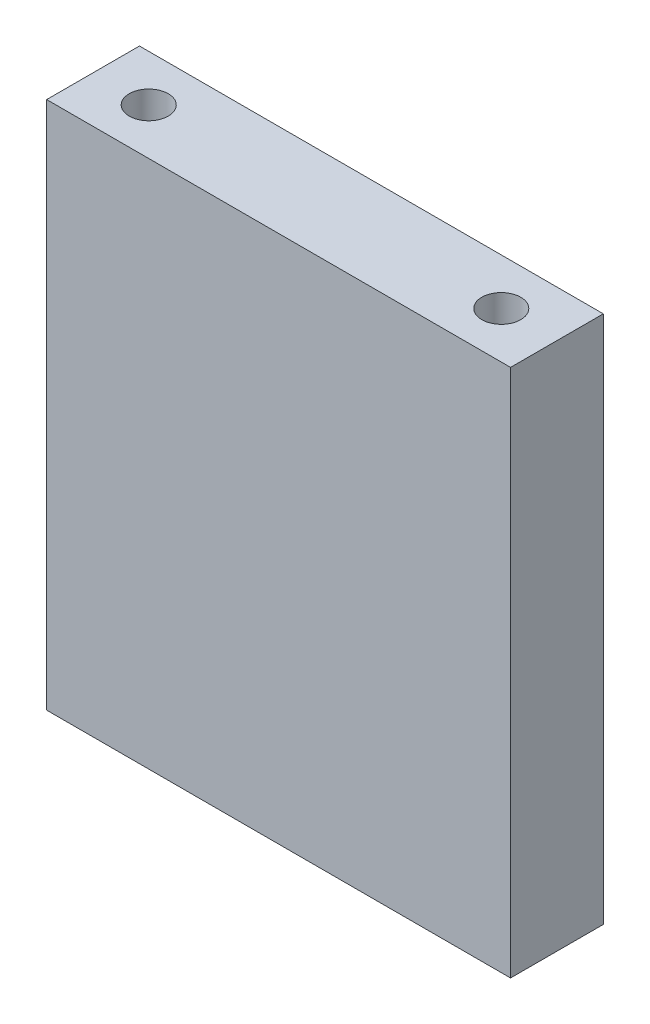
ISO-10303-21;
HEADER;
FILE_DESCRIPTION(('STEP AP214'),'2;1');
FILE_NAME('part.step','',(''),(''),'','','');
FILE_SCHEMA(('AUTOMOTIVE_DESIGN { 1 0 10303 214 1 1 1 1 }'));
ENDSEC;
DATA;
#1=APPLICATION_CONTEXT('core data for automotive mechanical design processes');
#2=APPLICATION_PROTOCOL_DEFINITION('international standard','automotive_design',2000,#1);
#3=PRODUCT_CONTEXT('',#1,'mechanical');
#4=PRODUCT('Part','Part','',(#3));
#5=PRODUCT_RELATED_PRODUCT_CATEGORY('part','',(#4));
#6=PRODUCT_DEFINITION_FORMATION('','',#4);
#7=PRODUCT_DEFINITION_CONTEXT('part definition',#1,'design');
#8=PRODUCT_DEFINITION('design','',#6,#7);
#9=PRODUCT_DEFINITION_SHAPE('','',#8);
#10=(LENGTH_UNIT() NAMED_UNIT(*) SI_UNIT(.MILLI.,.METRE.));
#11=(NAMED_UNIT(*) PLANE_ANGLE_UNIT() SI_UNIT($,.RADIAN.));
#12=(NAMED_UNIT(*) SI_UNIT($,.STERADIAN.) SOLID_ANGLE_UNIT());
#13=UNCERTAINTY_MEASURE_WITH_UNIT(LENGTH_MEASURE(1.E-05),#10,'distance_accuracy_value','');
#14=(GEOMETRIC_REPRESENTATION_CONTEXT(3) GLOBAL_UNCERTAINTY_ASSIGNED_CONTEXT((#13)) GLOBAL_UNIT_ASSIGNED_CONTEXT((#10,
#11,#12)) REPRESENTATION_CONTEXT('',''));
#15=CARTESIAN_POINT('',(0.,0.,0.));
#16=DIRECTION('',(0.,0.,1.));
#17=DIRECTION('',(1.,0.,0.));
#18=AXIS2_PLACEMENT_3D('',#15,#16,#17);
#19=CARTESIAN_POINT('',(0.,0.,0.));
#20=DIRECTION('',(0.,0.,-1.));
#21=DIRECTION('',(-1.,0.,0.));
#22=AXIS2_PLACEMENT_3D('',#19,#20,#21);
#23=PLANE('',#22);
#24=DIRECTION('',(0.,-1.,0.));
#25=VECTOR('',#24,1.);
#26=CARTESIAN_POINT('',(0.,0.,0.));
#27=LINE('',#26,#25);
#28=CARTESIAN_POINT('',(0.,57.,0.));
#29=VERTEX_POINT('',#28);
#30=CARTESIAN_POINT('',(0.,0.,0.));
#31=VERTEX_POINT('',#30);
#32=EDGE_CURVE('E137',#29,#31,#27,.T.);
#33=ORIENTED_EDGE('',*,*,#32,.F.);
#34=DIRECTION('',(-1.,0.,0.));
#35=VECTOR('',#34,1.);
#36=CARTESIAN_POINT('',(0.,57.,0.));
#37=LINE('',#36,#35);
#38=CARTESIAN_POINT('',(50.,57.,0.));
#39=VERTEX_POINT('',#38);
#40=EDGE_CURVE('E49',#39,#29,#37,.T.);
#41=ORIENTED_EDGE('',*,*,#40,.F.);
#42=DIRECTION('',(0.,1.,0.));
#43=VECTOR('',#42,1.);
#44=CARTESIAN_POINT('',(50.,0.,0.));
#45=LINE('',#44,#43);
#46=CARTESIAN_POINT('',(50.,0.,0.));
#47=VERTEX_POINT('',#46);
#48=EDGE_CURVE('E57',#47,#39,#45,.T.);
#49=ORIENTED_EDGE('',*,*,#48,.F.);
#50=DIRECTION('',(1.,0.,0.));
#51=VECTOR('',#50,1.);
#52=CARTESIAN_POINT('',(0.,0.,0.));
#53=LINE('',#52,#51);
#54=EDGE_CURVE('E140',#31,#47,#53,.T.);
#55=ORIENTED_EDGE('',*,*,#54,.F.);
#56=EDGE_LOOP('',(#33,#41,#49,#55));
#57=FACE_BOUND('',#56,.T.);
#58=CARTESIAN_POINT('',(25.,25.,0.));
#59=DIRECTION('',(0.,0.,1.));
#60=DIRECTION('',(1.,0.,0.));
#61=AXIS2_PLACEMENT_3D('',#58,#59,#60);
#62=CIRCLE('',#61,13.);
#63=CARTESIAN_POINT('',(38.,25.,0.));
#64=VERTEX_POINT('',#63);
#65=EDGE_CURVE('E134',#64,#64,#62,.T.);
#66=ORIENTED_EDGE('',*,*,#65,.T.);
#67=EDGE_LOOP('',(#66));
#68=FACE_BOUND('',#67,.T.);
#69=ADVANCED_FACE('F34',(#57,#68),#23,.T.);
#70=CARTESIAN_POINT('',(0.,0.,8.));
#71=DIRECTION('',(1.,0.,0.));
#72=DIRECTION('',(0.,1.,0.));
#73=AXIS2_PLACEMENT_3D('',#70,#71,#72);
#74=PLANE('',#73);
#75=ORIENTED_EDGE('',*,*,#32,.T.);
#76=DIRECTION('',(0.,0.,-1.));
#77=VECTOR('',#76,1.);
#78=CARTESIAN_POINT('',(0.,0.,8.));
#79=LINE('',#78,#77);
#80=CARTESIAN_POINT('',(0.,0.,10.));
#81=VERTEX_POINT('',#80);
#82=EDGE_CURVE('E11',#81,#31,#79,.T.);
#83=ORIENTED_EDGE('',*,*,#82,.F.);
#84=DIRECTION('',(0.,-1.,0.));
#85=VECTOR('',#84,1.);
#86=CARTESIAN_POINT('',(0.,57.,10.));
#87=LINE('',#86,#85);
#88=CARTESIAN_POINT('',(0.,57.,10.));
#89=VERTEX_POINT('',#88);
#90=EDGE_CURVE('E125',#89,#81,#87,.T.);
#91=ORIENTED_EDGE('',*,*,#90,.F.);
#92=DIRECTION('',(0.,0.,-1.));
#93=VECTOR('',#92,1.);
#94=CARTESIAN_POINT('',(0.,57.,8.));
#95=LINE('',#94,#93);
#96=EDGE_CURVE('E144',#89,#29,#95,.T.);
#97=ORIENTED_EDGE('',*,*,#96,.T.);
#98=EDGE_LOOP('',(#75,#83,#91,#97));
#99=FACE_BOUND('',#98,.T.);
#100=ADVANCED_FACE('F36',(#99),#74,.F.);
#101=CARTESIAN_POINT('',(0.,0.,8.));
#102=DIRECTION('',(0.,1.,0.));
#103=DIRECTION('',(-1.,0.,0.));
#104=AXIS2_PLACEMENT_3D('',#101,#102,#103);
#105=PLANE('',#104);
#106=CARTESIAN_POINT('',(6.,0.,5.));
#107=DIRECTION('',(0.,-1.,0.));
#108=DIRECTION('',(0.,0.,-1.));
#109=AXIS2_PLACEMENT_3D('',#106,#107,#108);
#110=CIRCLE('',#109,2.1);
#111=CARTESIAN_POINT('',(6.,0.,2.9));
#112=VERTEX_POINT('',#111);
#113=EDGE_CURVE('E107',#112,#112,#110,.T.);
#114=ORIENTED_EDGE('',*,*,#113,.F.);
#115=EDGE_LOOP('',(#114));
#116=FACE_BOUND('',#115,.T.);
#117=CARTESIAN_POINT('',(44.,0.,5.));
#118=DIRECTION('',(0.,-1.,0.));
#119=DIRECTION('',(0.,0.,-1.));
#120=AXIS2_PLACEMENT_3D('',#117,#118,#119);
#121=CIRCLE('',#120,2.1);
#122=CARTESIAN_POINT('',(44.,0.,2.9));
#123=VERTEX_POINT('',#122);
#124=EDGE_CURVE('E113',#123,#123,#121,.T.);
#125=ORIENTED_EDGE('',*,*,#124,.F.);
#126=EDGE_LOOP('',(#125));
#127=FACE_BOUND('',#126,.T.);
#128=ORIENTED_EDGE('',*,*,#54,.T.);
#129=DIRECTION('',(0.,0.,-1.));
#130=VECTOR('',#129,1.);
#131=CARTESIAN_POINT('',(50.,0.,8.));
#132=LINE('',#131,#130);
#133=CARTESIAN_POINT('',(50.,0.,10.));
#134=VERTEX_POINT('',#133);
#135=EDGE_CURVE('E42',#134,#47,#132,.T.);
#136=ORIENTED_EDGE('',*,*,#135,.F.);
#137=DIRECTION('',(1.,0.,0.));
#138=VECTOR('',#137,1.);
#139=CARTESIAN_POINT('',(50.,0.,10.));
#140=LINE('',#139,#138);
#141=EDGE_CURVE('E128',#81,#134,#140,.T.);
#142=ORIENTED_EDGE('',*,*,#141,.F.);
#143=ORIENTED_EDGE('',*,*,#82,.T.);
#144=EDGE_LOOP('',(#128,#136,#142,#143));
#145=FACE_BOUND('',#144,.T.);
#146=ADVANCED_FACE('F160',(#116,#127,#145),#105,.F.);
#147=CARTESIAN_POINT('',(50.,0.,8.));
#148=DIRECTION('',(-1.,0.,0.));
#149=DIRECTION('',(0.,-1.,0.));
#150=AXIS2_PLACEMENT_3D('',#147,#148,#149);
#151=PLANE('',#150);
#152=ORIENTED_EDGE('',*,*,#48,.T.);
#153=DIRECTION('',(0.,0.,-1.));
#154=VECTOR('',#153,1.);
#155=CARTESIAN_POINT('',(50.,57.,8.));
#156=LINE('',#155,#154);
#157=CARTESIAN_POINT('',(50.,57.,10.));
#158=VERTEX_POINT('',#157);
#159=EDGE_CURVE('E146',#158,#39,#156,.T.);
#160=ORIENTED_EDGE('',*,*,#159,.F.);
#161=DIRECTION('',(0.,1.,0.));
#162=VECTOR('',#161,1.);
#163=CARTESIAN_POINT('',(50.,57.,10.));
#164=LINE('',#163,#162);
#165=EDGE_CURVE('E119',#134,#158,#164,.T.);
#166=ORIENTED_EDGE('',*,*,#165,.F.);
#167=ORIENTED_EDGE('',*,*,#135,.T.);
#168=EDGE_LOOP('',(#152,#160,#166,#167));
#169=FACE_BOUND('',#168,.T.);
#170=ADVANCED_FACE('F148',(#169),#151,.F.);
#171=CARTESIAN_POINT('',(0.,57.,8.));
#172=DIRECTION('',(0.,-1.,0.));
#173=DIRECTION('',(0.,0.,-1.));
#174=AXIS2_PLACEMENT_3D('',#171,#172,#173);
#175=PLANE('',#174);
#176=CARTESIAN_POINT('',(6.,57.,5.));
#177=DIRECTION('',(0.,1.,0.));
#178=DIRECTION('',(0.,0.,1.));
#179=AXIS2_PLACEMENT_3D('',#176,#177,#178);
#180=CIRCLE('',#179,2.09999999999999);
#181=CARTESIAN_POINT('',(6.,57.,7.09999999999999));
#182=VERTEX_POINT('',#181);
#183=EDGE_CURVE('E97',#182,#182,#180,.T.);
#184=ORIENTED_EDGE('',*,*,#183,.F.);
#185=EDGE_LOOP('',(#184));
#186=FACE_BOUND('',#185,.T.);
#187=CARTESIAN_POINT('',(44.,57.,5.));
#188=DIRECTION('',(0.,1.,0.));
#189=DIRECTION('',(0.,0.,1.));
#190=AXIS2_PLACEMENT_3D('',#187,#188,#189);
#191=CIRCLE('',#190,2.09999999999999);
#192=CARTESIAN_POINT('',(44.,57.,7.09999999999999));
#193=VERTEX_POINT('',#192);
#194=EDGE_CURVE('E96',#193,#193,#191,.T.);
#195=ORIENTED_EDGE('',*,*,#194,.F.);
#196=EDGE_LOOP('',(#195));
#197=FACE_BOUND('',#196,.T.);
#198=ORIENTED_EDGE('',*,*,#40,.T.);
#199=ORIENTED_EDGE('',*,*,#96,.F.);
#200=DIRECTION('',(-1.,0.,0.));
#201=VECTOR('',#200,1.);
#202=CARTESIAN_POINT('',(50.,57.,10.));
#203=LINE('',#202,#201);
#204=EDGE_CURVE('E122',#158,#89,#203,.T.);
#205=ORIENTED_EDGE('',*,*,#204,.F.);
#206=ORIENTED_EDGE('',*,*,#159,.T.);
#207=EDGE_LOOP('',(#198,#199,#205,#206));
#208=FACE_BOUND('',#207,.T.);
#209=ADVANCED_FACE('F157',(#186,#197,#208),#175,.F.);
#210=CARTESIAN_POINT('',(25.,25.,8.));
#211=DIRECTION('',(0.,0.,-1.));
#212=DIRECTION('',(-1.,0.,0.));
#213=AXIS2_PLACEMENT_3D('',#210,#211,#212);
#214=CYLINDRICAL_SURFACE('',#213,13.);
#215=CARTESIAN_POINT('',(25.,25.,8.));
#216=DIRECTION('',(0.,0.,1.));
#217=DIRECTION('',(1.,0.,0.));
#218=AXIS2_PLACEMENT_3D('',#215,#216,#217);
#219=CIRCLE('',#218,13.);
#220=CARTESIAN_POINT('',(38.,25.,8.));
#221=VERTEX_POINT('',#220);
#222=EDGE_CURVE('E131',#221,#221,#219,.T.);
#223=ORIENTED_EDGE('',*,*,#222,.T.);
#224=EDGE_LOOP('',(#223));
#225=FACE_BOUND('',#224,.T.);
#226=ORIENTED_EDGE('',*,*,#65,.F.);
#227=EDGE_LOOP('',(#226));
#228=FACE_BOUND('',#227,.T.);
#229=ADVANCED_FACE('F176',(#225,#228),#214,.F.);
#230=CARTESIAN_POINT('',(0.,0.,8.));
#231=DIRECTION('',(0.,0.,-1.));
#232=DIRECTION('',(-1.,0.,0.));
#233=AXIS2_PLACEMENT_3D('',#230,#231,#232);
#234=PLANE('',#233);
#235=ORIENTED_EDGE('',*,*,#222,.F.);
#236=EDGE_LOOP('',(#235));
#237=FACE_BOUND('',#236,.T.);
#238=ADVANCED_FACE('F183',(#237),#234,.T.);
#239=CARTESIAN_POINT('',(0.,0.,10.));
#240=DIRECTION('',(0.,0.,-1.));
#241=DIRECTION('',(-1.,0.,0.));
#242=AXIS2_PLACEMENT_3D('',#239,#240,#241);
#243=PLANE('',#242);
#244=ORIENTED_EDGE('',*,*,#165,.T.);
#245=ORIENTED_EDGE('',*,*,#204,.T.);
#246=ORIENTED_EDGE('',*,*,#90,.T.);
#247=ORIENTED_EDGE('',*,*,#141,.T.);
#248=EDGE_LOOP('',(#244,#245,#246,#247));
#249=FACE_BOUND('',#248,.T.);
#250=ADVANCED_FACE('F159',(#249),#243,.F.);
#251=CARTESIAN_POINT('',(44.,15.,5.));
#252=DIRECTION('',(0.,-1.,0.));
#253=DIRECTION('',(0.,0.,-1.));
#254=AXIS2_PLACEMENT_3D('',#251,#252,#253);
#255=CONICAL_SURFACE('',#254,2.1,1.02974425867665);
#256=CARTESIAN_POINT('',(44.,16.2618072999579,5.));
#257=VERTEX_POINT('',#256);
#258=VERTEX_LOOP('',#257);
#259=FACE_BOUND('',#258,.T.);
#260=CARTESIAN_POINT('',(44.,15.,5.));
#261=DIRECTION('',(0.,-1.,0.));
#262=DIRECTION('',(0.,0.,-1.));
#263=AXIS2_PLACEMENT_3D('',#260,#261,#262);
#264=CIRCLE('',#263,2.1);
#265=CARTESIAN_POINT('',(44.,15.,2.9));
#266=VERTEX_POINT('',#265);
#267=EDGE_CURVE('E116',#266,#266,#264,.T.);
#268=ORIENTED_EDGE('',*,*,#267,.T.);
#269=EDGE_LOOP('',(#268));
#270=FACE_BOUND('',#269,.T.);
#271=ADVANCED_FACE('F212',(#259,#270),#255,.F.);
#272=CARTESIAN_POINT('',(44.,0.,5.));
#273=DIRECTION('',(0.,-1.,0.));
#274=DIRECTION('',(0.,0.,-1.));
#275=AXIS2_PLACEMENT_3D('',#272,#273,#274);
#276=CYLINDRICAL_SURFACE('',#275,2.1);
#277=ORIENTED_EDGE('',*,*,#267,.F.);
#278=EDGE_LOOP('',(#277));
#279=FACE_BOUND('',#278,.T.);
#280=ORIENTED_EDGE('',*,*,#124,.T.);
#281=EDGE_LOOP('',(#280));
#282=FACE_BOUND('',#281,.T.);
#283=ADVANCED_FACE('F208',(#279,#282),#276,.F.);
#284=CARTESIAN_POINT('',(6.,15.,5.));
#285=DIRECTION('',(0.,-1.,0.));
#286=DIRECTION('',(0.,0.,-1.));
#287=AXIS2_PLACEMENT_3D('',#284,#285,#286);
#288=CONICAL_SURFACE('',#287,2.1,1.02974425867665);
#289=CARTESIAN_POINT('',(6.,16.2618072999579,5.));
#290=VERTEX_POINT('',#289);
#291=VERTEX_LOOP('',#290);
#292=FACE_BOUND('',#291,.T.);
#293=CARTESIAN_POINT('',(6.,15.,5.));
#294=DIRECTION('',(0.,-1.,0.));
#295=DIRECTION('',(0.,0.,-1.));
#296=AXIS2_PLACEMENT_3D('',#293,#294,#295);
#297=CIRCLE('',#296,2.1);
#298=CARTESIAN_POINT('',(6.,15.,2.9));
#299=VERTEX_POINT('',#298);
#300=EDGE_CURVE('E110',#299,#299,#297,.T.);
#301=ORIENTED_EDGE('',*,*,#300,.T.);
#302=EDGE_LOOP('',(#301));
#303=FACE_BOUND('',#302,.T.);
#304=ADVANCED_FACE('F204',(#292,#303),#288,.F.);
#305=CARTESIAN_POINT('',(6.,0.,5.));
#306=DIRECTION('',(0.,-1.,0.));
#307=DIRECTION('',(0.,0.,-1.));
#308=AXIS2_PLACEMENT_3D('',#305,#306,#307);
#309=CYLINDRICAL_SURFACE('',#308,2.1);
#310=ORIENTED_EDGE('',*,*,#300,.F.);
#311=EDGE_LOOP('',(#310));
#312=FACE_BOUND('',#311,.T.);
#313=ORIENTED_EDGE('',*,*,#113,.T.);
#314=EDGE_LOOP('',(#313));
#315=FACE_BOUND('',#314,.T.);
#316=ADVANCED_FACE('F196',(#312,#315),#309,.F.);
#317=CARTESIAN_POINT('',(44.,42.,5.));
#318=DIRECTION('',(0.,1.,0.));
#319=DIRECTION('',(0.,0.,1.));
#320=AXIS2_PLACEMENT_3D('',#317,#318,#319);
#321=CONICAL_SURFACE('',#320,2.09999999999998,1.02974425867665);
#322=CARTESIAN_POINT('',(44.,40.7381927000421,5.));
#323=VERTEX_POINT('',#322);
#324=VERTEX_LOOP('',#323);
#325=FACE_BOUND('',#324,.T.);
#326=CARTESIAN_POINT('',(44.,42.,5.));
#327=DIRECTION('',(0.,1.,0.));
#328=DIRECTION('',(0.,0.,1.));
#329=AXIS2_PLACEMENT_3D('',#326,#327,#328);
#330=CIRCLE('',#329,2.09999999999998);
#331=CARTESIAN_POINT('',(44.,42.,7.09999999999998));
#332=VERTEX_POINT('',#331);
#333=EDGE_CURVE('E100',#332,#332,#330,.T.);
#334=ORIENTED_EDGE('',*,*,#333,.T.);
#335=EDGE_LOOP('',(#334));
#336=FACE_BOUND('',#335,.T.);
#337=ADVANCED_FACE('F190',(#325,#336),#321,.F.);
#338=CARTESIAN_POINT('',(44.,57.,5.));
#339=DIRECTION('',(0.,1.,0.));
#340=DIRECTION('',(0.,0.,1.));
#341=AXIS2_PLACEMENT_3D('',#338,#339,#340);
#342=CYLINDRICAL_SURFACE('',#341,2.09999999999999);
#343=ORIENTED_EDGE('',*,*,#333,.F.);
#344=EDGE_LOOP('',(#343));
#345=FACE_BOUND('',#344,.T.);
#346=ORIENTED_EDGE('',*,*,#194,.T.);
#347=EDGE_LOOP('',(#346));
#348=FACE_BOUND('',#347,.T.);
#349=ADVANCED_FACE('F90',(#345,#348),#342,.F.);
#350=CARTESIAN_POINT('',(6.,42.,5.));
#351=DIRECTION('',(0.,1.,0.));
#352=DIRECTION('',(0.,0.,1.));
#353=AXIS2_PLACEMENT_3D('',#350,#351,#352);
#354=CONICAL_SURFACE('',#353,2.09999999999999,1.02974425867665);
#355=CARTESIAN_POINT('',(5.99999999999999,40.7381927000421,5.));
#356=VERTEX_POINT('',#355);
#357=VERTEX_LOOP('',#356);
#358=FACE_BOUND('',#357,.T.);
#359=CARTESIAN_POINT('',(6.,42.,5.));
#360=DIRECTION('',(0.,1.,0.));
#361=DIRECTION('',(0.,0.,1.));
#362=AXIS2_PLACEMENT_3D('',#359,#360,#361);
#363=CIRCLE('',#362,2.09999999999999);
#364=CARTESIAN_POINT('',(6.,42.,7.09999999999999));
#365=VERTEX_POINT('',#364);
#366=EDGE_CURVE('E94',#365,#365,#363,.T.);
#367=ORIENTED_EDGE('',*,*,#366,.T.);
#368=EDGE_LOOP('',(#367));
#369=FACE_BOUND('',#368,.T.);
#370=ADVANCED_FACE('F86',(#358,#369),#354,.F.);
#371=CARTESIAN_POINT('',(6.,57.,5.));
#372=DIRECTION('',(0.,1.,0.));
#373=DIRECTION('',(0.,0.,1.));
#374=AXIS2_PLACEMENT_3D('',#371,#372,#373);
#375=CYLINDRICAL_SURFACE('',#374,2.09999999999999);
#376=ORIENTED_EDGE('',*,*,#366,.F.);
#377=EDGE_LOOP('',(#376));
#378=FACE_BOUND('',#377,.T.);
#379=ORIENTED_EDGE('',*,*,#183,.T.);
#380=EDGE_LOOP('',(#379));
#381=FACE_BOUND('',#380,.T.);
#382=ADVANCED_FACE('F89',(#378,#381),#375,.F.);
#383=CLOSED_SHELL('',(#69,#100,#146,#170,#209,#229,#238,#250,#271,#283,#304,#316,#337,#349,#370,#382));
#384=MANIFOLD_SOLID_BREP('B2',#383);
#385=ADVANCED_BREP_SHAPE_REPRESENTATION('',(#18,#384),#14);
#386=SHAPE_DEFINITION_REPRESENTATION(#9,#385);
ENDSEC;
END-ISO-10303-21;
